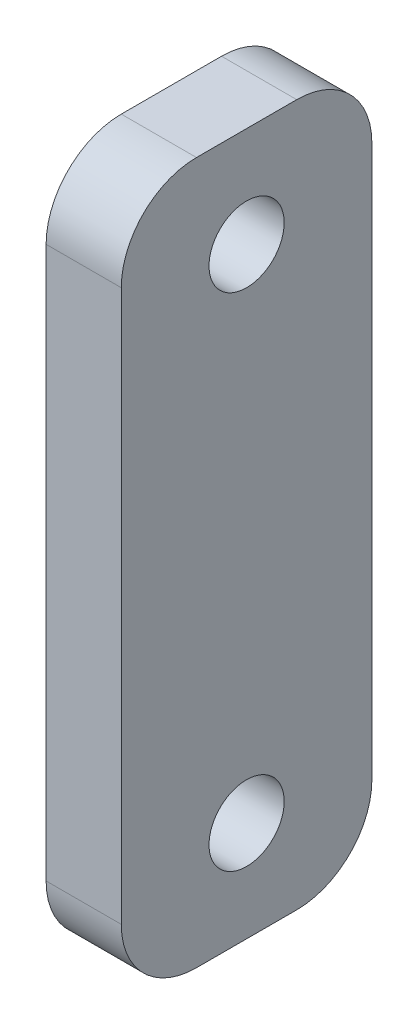
ISO-10303-21;
HEADER;
FILE_DESCRIPTION(('STEP AP214'),'2;1');
FILE_NAME('part.step','',(''),(''),'','','');
FILE_SCHEMA(('AUTOMOTIVE_DESIGN { 1 0 10303 214 1 1 1 1 }'));
ENDSEC;
DATA;
#1=APPLICATION_CONTEXT('core data for automotive mechanical design processes');
#2=APPLICATION_PROTOCOL_DEFINITION('international standard','automotive_design',2000,#1);
#3=PRODUCT_CONTEXT('',#1,'mechanical');
#4=PRODUCT('Part','Part','',(#3));
#5=PRODUCT_RELATED_PRODUCT_CATEGORY('part','',(#4));
#6=PRODUCT_DEFINITION_FORMATION('','',#4);
#7=PRODUCT_DEFINITION_CONTEXT('part definition',#1,'design');
#8=PRODUCT_DEFINITION('design','',#6,#7);
#9=PRODUCT_DEFINITION_SHAPE('','',#8);
#10=(LENGTH_UNIT() NAMED_UNIT(*) SI_UNIT(.MILLI.,.METRE.));
#11=(NAMED_UNIT(*) PLANE_ANGLE_UNIT() SI_UNIT($,.RADIAN.));
#12=(NAMED_UNIT(*) SI_UNIT($,.STERADIAN.) SOLID_ANGLE_UNIT());
#13=UNCERTAINTY_MEASURE_WITH_UNIT(LENGTH_MEASURE(1.E-05),#10,'distance_accuracy_value','');
#14=(GEOMETRIC_REPRESENTATION_CONTEXT(3) GLOBAL_UNCERTAINTY_ASSIGNED_CONTEXT((#13)) GLOBAL_UNIT_ASSIGNED_CONTEXT((#10,
#11,#12)) REPRESENTATION_CONTEXT('',''));
#15=CARTESIAN_POINT('',(0.,0.,0.));
#16=DIRECTION('',(0.,0.,1.));
#17=DIRECTION('',(1.,0.,0.));
#18=AXIS2_PLACEMENT_3D('',#15,#16,#17);
#19=CARTESIAN_POINT('',(15.,0.,-25.));
#20=DIRECTION('',(0.,0.,-1.));
#21=DIRECTION('',(-1.,0.,0.));
#22=AXIS2_PLACEMENT_3D('',#19,#20,#21);
#23=PLANE('',#22);
#24=DIRECTION('',(0.,-1.,0.));
#25=VECTOR('',#24,1.);
#26=CARTESIAN_POINT('',(15.,0.,-25.));
#27=LINE('',#26,#25);
#28=CARTESIAN_POINT('',(15.,55.,-25.));
#29=VERTEX_POINT('',#28);
#30=CARTESIAN_POINT('',(15.,-55.,-25.));
#31=VERTEX_POINT('',#30);
#32=EDGE_CURVE('E186',#29,#31,#27,.T.);
#33=ORIENTED_EDGE('',*,*,#32,.T.);
#34=DIRECTION('',(-1.,0.,0.));
#35=VECTOR('',#34,1.);
#36=CARTESIAN_POINT('',(0.,-55.,-25.));
#37=LINE('',#36,#35);
#38=CARTESIAN_POINT('',(0.,-55.,-25.));
#39=VERTEX_POINT('',#38);
#40=EDGE_CURVE('E128',#31,#39,#37,.T.);
#41=ORIENTED_EDGE('',*,*,#40,.T.);
#42=DIRECTION('',(0.,-1.,0.));
#43=VECTOR('',#42,1.);
#44=CARTESIAN_POINT('',(0.,0.,-25.));
#45=LINE('',#44,#43);
#46=CARTESIAN_POINT('',(0.,55.,-25.));
#47=VERTEX_POINT('',#46);
#48=EDGE_CURVE('E112',#47,#39,#45,.T.);
#49=ORIENTED_EDGE('',*,*,#48,.F.);
#50=DIRECTION('',(-1.,0.,0.));
#51=VECTOR('',#50,1.);
#52=CARTESIAN_POINT('',(15.,55.,-25.));
#53=LINE('',#52,#51);
#54=EDGE_CURVE('E125',#47,#29,#53,.F.);
#55=ORIENTED_EDGE('',*,*,#54,.T.);
#56=EDGE_LOOP('',(#33,#41,#49,#55));
#57=FACE_BOUND('',#56,.T.);
#58=ADVANCED_FACE('F41',(#57),#23,.T.);
#59=CARTESIAN_POINT('',(15.,70.,0.));
#60=DIRECTION('',(0.,1.,0.));
#61=DIRECTION('',(0.,0.,1.));
#62=AXIS2_PLACEMENT_3D('',#59,#60,#61);
#63=PLANE('',#62);
#64=DIRECTION('',(0.,0.,-1.));
#65=VECTOR('',#64,1.);
#66=CARTESIAN_POINT('',(15.,70.,0.));
#67=LINE('',#66,#65);
#68=CARTESIAN_POINT('',(15.,70.,10.));
#69=VERTEX_POINT('',#68);
#70=CARTESIAN_POINT('',(15.,70.,-10.));
#71=VERTEX_POINT('',#70);
#72=EDGE_CURVE('E182',#69,#71,#67,.T.);
#73=ORIENTED_EDGE('',*,*,#72,.T.);
#74=DIRECTION('',(-1.,0.,0.));
#75=VECTOR('',#74,1.);
#76=CARTESIAN_POINT('',(15.,70.,-10.));
#77=LINE('',#76,#75);
#78=CARTESIAN_POINT('',(0.,70.,-10.));
#79=VERTEX_POINT('',#78);
#80=EDGE_CURVE('E11',#71,#79,#77,.T.);
#81=ORIENTED_EDGE('',*,*,#80,.T.);
#82=DIRECTION('',(0.,0.,-1.));
#83=VECTOR('',#82,1.);
#84=CARTESIAN_POINT('',(0.,70.,0.));
#85=LINE('',#84,#83);
#86=CARTESIAN_POINT('',(0.,70.,10.));
#87=VERTEX_POINT('',#86);
#88=EDGE_CURVE('E114',#87,#79,#85,.T.);
#89=ORIENTED_EDGE('',*,*,#88,.F.);
#90=DIRECTION('',(-1.,0.,0.));
#91=VECTOR('',#90,1.);
#92=CARTESIAN_POINT('',(15.,70.,10.));
#93=LINE('',#92,#91);
#94=EDGE_CURVE('E50',#87,#69,#93,.F.);
#95=ORIENTED_EDGE('',*,*,#94,.T.);
#96=EDGE_LOOP('',(#73,#81,#89,#95));
#97=FACE_BOUND('',#96,.T.);
#98=ADVANCED_FACE('F181',(#97),#63,.T.);
#99=CARTESIAN_POINT('',(15.,0.,25.));
#100=DIRECTION('',(0.,0.,-1.));
#101=DIRECTION('',(-1.,0.,0.));
#102=AXIS2_PLACEMENT_3D('',#99,#100,#101);
#103=PLANE('',#102);
#104=DIRECTION('',(0.,-1.,0.));
#105=VECTOR('',#104,1.);
#106=CARTESIAN_POINT('',(0.,0.,25.));
#107=LINE('',#106,#105);
#108=CARTESIAN_POINT('',(0.,55.,25.));
#109=VERTEX_POINT('',#108);
#110=CARTESIAN_POINT('',(0.,-55.,25.));
#111=VERTEX_POINT('',#110);
#112=EDGE_CURVE('E191',#109,#111,#107,.T.);
#113=ORIENTED_EDGE('',*,*,#112,.T.);
#114=DIRECTION('',(-1.,0.,0.));
#115=VECTOR('',#114,1.);
#116=CARTESIAN_POINT('',(15.,-55.,25.));
#117=LINE('',#116,#115);
#118=CARTESIAN_POINT('',(15.,-55.,25.));
#119=VERTEX_POINT('',#118);
#120=EDGE_CURVE('E57',#111,#119,#117,.F.);
#121=ORIENTED_EDGE('',*,*,#120,.T.);
#122=DIRECTION('',(0.,-1.,0.));
#123=VECTOR('',#122,1.);
#124=CARTESIAN_POINT('',(15.,0.,25.));
#125=LINE('',#124,#123);
#126=CARTESIAN_POINT('',(15.,55.,25.));
#127=VERTEX_POINT('',#126);
#128=EDGE_CURVE('E142',#127,#119,#125,.T.);
#129=ORIENTED_EDGE('',*,*,#128,.F.);
#130=DIRECTION('',(-1.,0.,0.));
#131=VECTOR('',#130,1.);
#132=CARTESIAN_POINT('',(0.,55.,25.));
#133=LINE('',#132,#131);
#134=EDGE_CURVE('E172',#127,#109,#133,.T.);
#135=ORIENTED_EDGE('',*,*,#134,.T.);
#136=EDGE_LOOP('',(#113,#121,#129,#135));
#137=FACE_BOUND('',#136,.T.);
#138=ADVANCED_FACE('F190',(#137),#103,.F.);
#139=CARTESIAN_POINT('',(15.,-70.,0.));
#140=DIRECTION('',(0.,1.,0.));
#141=DIRECTION('',(0.,0.,1.));
#142=AXIS2_PLACEMENT_3D('',#139,#140,#141);
#143=PLANE('',#142);
#144=DIRECTION('',(0.,0.,-1.));
#145=VECTOR('',#144,1.);
#146=CARTESIAN_POINT('',(0.,-70.,0.));
#147=LINE('',#146,#145);
#148=CARTESIAN_POINT('',(0.,-70.,10.));
#149=VERTEX_POINT('',#148);
#150=CARTESIAN_POINT('',(0.,-70.,-10.));
#151=VERTEX_POINT('',#150);
#152=EDGE_CURVE('E145',#149,#151,#147,.T.);
#153=ORIENTED_EDGE('',*,*,#152,.T.);
#154=DIRECTION('',(-1.,0.,0.));
#155=VECTOR('',#154,1.);
#156=CARTESIAN_POINT('',(15.,-70.,-10.));
#157=LINE('',#156,#155);
#158=CARTESIAN_POINT('',(15.,-70.,-10.));
#159=VERTEX_POINT('',#158);
#160=EDGE_CURVE('E159',#151,#159,#157,.F.);
#161=ORIENTED_EDGE('',*,*,#160,.T.);
#162=DIRECTION('',(0.,0.,-1.));
#163=VECTOR('',#162,1.);
#164=CARTESIAN_POINT('',(15.,-70.,0.));
#165=LINE('',#164,#163);
#166=CARTESIAN_POINT('',(15.,-70.,10.));
#167=VERTEX_POINT('',#166);
#168=EDGE_CURVE('E136',#167,#159,#165,.T.);
#169=ORIENTED_EDGE('',*,*,#168,.F.);
#170=DIRECTION('',(-1.,0.,0.));
#171=VECTOR('',#170,1.);
#172=CARTESIAN_POINT('',(15.,-70.,10.));
#173=LINE('',#172,#171);
#174=EDGE_CURVE('E155',#167,#149,#173,.T.);
#175=ORIENTED_EDGE('',*,*,#174,.T.);
#176=EDGE_LOOP('',(#153,#161,#169,#175));
#177=FACE_BOUND('',#176,.T.);
#178=ADVANCED_FACE('F224',(#177),#143,.F.);
#179=CARTESIAN_POINT('',(15.,0.,0.));
#180=DIRECTION('',(1.,0.,0.));
#181=DIRECTION('',(0.,0.,-1.));
#182=AXIS2_PLACEMENT_3D('',#179,#180,#181);
#183=PLANE('',#182);
#184=CARTESIAN_POINT('',(15.,-50.,0.));
#185=DIRECTION('',(1.,0.,0.));
#186=DIRECTION('',(0.,0.,-1.));
#187=AXIS2_PLACEMENT_3D('',#184,#185,#186);
#188=CIRCLE('',#187,7.5);
#189=CARTESIAN_POINT('',(15.,-50.,-7.50000000000001));
#190=VERTEX_POINT('',#189);
#191=EDGE_CURVE('E130',#190,#190,#188,.T.);
#192=ORIENTED_EDGE('',*,*,#191,.F.);
#193=EDGE_LOOP('',(#192));
#194=FACE_BOUND('',#193,.T.);
#195=CARTESIAN_POINT('',(15.,50.,0.));
#196=DIRECTION('',(1.,0.,0.));
#197=DIRECTION('',(0.,0.,-1.));
#198=AXIS2_PLACEMENT_3D('',#195,#196,#197);
#199=CIRCLE('',#198,7.5);
#200=CARTESIAN_POINT('',(15.,50.,-7.50000000000001));
#201=VERTEX_POINT('',#200);
#202=EDGE_CURVE('E203',#201,#201,#199,.T.);
#203=ORIENTED_EDGE('',*,*,#202,.F.);
#204=EDGE_LOOP('',(#203));
#205=FACE_BOUND('',#204,.T.);
#206=ORIENTED_EDGE('',*,*,#168,.T.);
#207=CARTESIAN_POINT('',(15.,-55.,-10.));
#208=DIRECTION('',(1.,0.,0.));
#209=DIRECTION('',(0.,0.,-1.));
#210=AXIS2_PLACEMENT_3D('',#207,#208,#209);
#211=CIRCLE('',#210,15.);
#212=EDGE_CURVE('E169',#159,#31,#211,.T.);
#213=ORIENTED_EDGE('',*,*,#212,.T.);
#214=ORIENTED_EDGE('',*,*,#32,.F.);
#215=CARTESIAN_POINT('',(15.,55.,-10.));
#216=DIRECTION('',(1.,0.,0.));
#217=DIRECTION('',(0.,0.,-1.));
#218=AXIS2_PLACEMENT_3D('',#215,#216,#217);
#219=CIRCLE('',#218,15.);
#220=EDGE_CURVE('E134',#29,#71,#219,.T.);
#221=ORIENTED_EDGE('',*,*,#220,.T.);
#222=ORIENTED_EDGE('',*,*,#72,.F.);
#223=CARTESIAN_POINT('',(15.,55.,10.));
#224=DIRECTION('',(1.,0.,0.));
#225=DIRECTION('',(0.,0.,-1.));
#226=AXIS2_PLACEMENT_3D('',#223,#224,#225);
#227=CIRCLE('',#226,15.);
#228=EDGE_CURVE('E64',#69,#127,#227,.T.);
#229=ORIENTED_EDGE('',*,*,#228,.T.);
#230=ORIENTED_EDGE('',*,*,#128,.T.);
#231=CARTESIAN_POINT('',(15.,-55.,10.));
#232=DIRECTION('',(1.,0.,0.));
#233=DIRECTION('',(0.,0.,-1.));
#234=AXIS2_PLACEMENT_3D('',#231,#232,#233);
#235=CIRCLE('',#234,15.);
#236=EDGE_CURVE('E166',#119,#167,#235,.T.);
#237=ORIENTED_EDGE('',*,*,#236,.T.);
#238=EDGE_LOOP('',(#206,#213,#214,#221,#222,#229,#230,#237));
#239=FACE_BOUND('',#238,.T.);
#240=ADVANCED_FACE('F184',(#194,#205,#239),#183,.T.);
#241=CARTESIAN_POINT('',(0.,0.,0.));
#242=DIRECTION('',(1.,0.,0.));
#243=DIRECTION('',(0.,0.,-1.));
#244=AXIS2_PLACEMENT_3D('',#241,#242,#243);
#245=PLANE('',#244);
#246=CARTESIAN_POINT('',(0.,-50.,0.));
#247=DIRECTION('',(1.,0.,0.));
#248=DIRECTION('',(0.,0.,-1.));
#249=AXIS2_PLACEMENT_3D('',#246,#247,#248);
#250=CIRCLE('',#249,7.5);
#251=CARTESIAN_POINT('',(0.,-50.,-7.50000000000001));
#252=VERTEX_POINT('',#251);
#253=EDGE_CURVE('E211',#252,#252,#250,.T.);
#254=ORIENTED_EDGE('',*,*,#253,.T.);
#255=EDGE_LOOP('',(#254));
#256=FACE_BOUND('',#255,.T.);
#257=CARTESIAN_POINT('',(0.,50.,0.));
#258=DIRECTION('',(1.,0.,0.));
#259=DIRECTION('',(0.,0.,-1.));
#260=AXIS2_PLACEMENT_3D('',#257,#258,#259);
#261=CIRCLE('',#260,7.5);
#262=CARTESIAN_POINT('',(0.,50.,-7.50000000000001));
#263=VERTEX_POINT('',#262);
#264=EDGE_CURVE('E207',#263,#263,#261,.T.);
#265=ORIENTED_EDGE('',*,*,#264,.T.);
#266=EDGE_LOOP('',(#265));
#267=FACE_BOUND('',#266,.T.);
#268=ORIENTED_EDGE('',*,*,#48,.T.);
#269=CARTESIAN_POINT('',(0.,-55.,-10.));
#270=DIRECTION('',(1.,0.,0.));
#271=DIRECTION('',(0.,0.,-1.));
#272=AXIS2_PLACEMENT_3D('',#269,#270,#271);
#273=CIRCLE('',#272,15.);
#274=EDGE_CURVE('E152',#39,#151,#273,.F.);
#275=ORIENTED_EDGE('',*,*,#274,.T.);
#276=ORIENTED_EDGE('',*,*,#152,.F.);
#277=CARTESIAN_POINT('',(0.,-55.,10.));
#278=DIRECTION('',(1.,0.,0.));
#279=DIRECTION('',(0.,0.,-1.));
#280=AXIS2_PLACEMENT_3D('',#277,#278,#279);
#281=CIRCLE('',#280,15.);
#282=EDGE_CURVE('E119',#149,#111,#281,.F.);
#283=ORIENTED_EDGE('',*,*,#282,.T.);
#284=ORIENTED_EDGE('',*,*,#112,.F.);
#285=CARTESIAN_POINT('',(0.,55.,10.));
#286=DIRECTION('',(1.,0.,0.));
#287=DIRECTION('',(0.,0.,-1.));
#288=AXIS2_PLACEMENT_3D('',#285,#286,#287);
#289=CIRCLE('',#288,15.);
#290=EDGE_CURVE('E120',#109,#87,#289,.F.);
#291=ORIENTED_EDGE('',*,*,#290,.T.);
#292=ORIENTED_EDGE('',*,*,#88,.T.);
#293=CARTESIAN_POINT('',(0.,55.,-10.));
#294=DIRECTION('',(1.,0.,0.));
#295=DIRECTION('',(0.,0.,-1.));
#296=AXIS2_PLACEMENT_3D('',#293,#294,#295);
#297=CIRCLE('',#296,15.);
#298=EDGE_CURVE('E109',#79,#47,#297,.F.);
#299=ORIENTED_EDGE('',*,*,#298,.T.);
#300=EDGE_LOOP('',(#268,#275,#276,#283,#284,#291,#292,#299));
#301=FACE_BOUND('',#300,.T.);
#302=ADVANCED_FACE('F111',(#256,#267,#301),#245,.F.);
#303=CARTESIAN_POINT('',(15.,50.,0.));
#304=DIRECTION('',(-1.,0.,0.));
#305=DIRECTION('',(0.,0.,1.));
#306=AXIS2_PLACEMENT_3D('',#303,#304,#305);
#307=CYLINDRICAL_SURFACE('',#306,7.5);
#308=ORIENTED_EDGE('',*,*,#202,.T.);
#309=EDGE_LOOP('',(#308));
#310=FACE_BOUND('',#309,.T.);
#311=ORIENTED_EDGE('',*,*,#264,.F.);
#312=EDGE_LOOP('',(#311));
#313=FACE_BOUND('',#312,.T.);
#314=ADVANCED_FACE('F228',(#310,#313),#307,.F.);
#315=CARTESIAN_POINT('',(15.,-50.,0.));
#316=DIRECTION('',(-1.,0.,0.));
#317=DIRECTION('',(0.,0.,1.));
#318=AXIS2_PLACEMENT_3D('',#315,#316,#317);
#319=CYLINDRICAL_SURFACE('',#318,7.5);
#320=ORIENTED_EDGE('',*,*,#191,.T.);
#321=EDGE_LOOP('',(#320));
#322=FACE_BOUND('',#321,.T.);
#323=ORIENTED_EDGE('',*,*,#253,.F.);
#324=EDGE_LOOP('',(#323));
#325=FACE_BOUND('',#324,.T.);
#326=ADVANCED_FACE('F219',(#322,#325),#319,.F.);
#327=CARTESIAN_POINT('',(15.,-55.,-10.));
#328=DIRECTION('',(1.,0.,0.));
#329=DIRECTION('',(0.,0.,-1.));
#330=AXIS2_PLACEMENT_3D('',#327,#328,#329);
#331=CYLINDRICAL_SURFACE('',#330,15.);
#332=ORIENTED_EDGE('',*,*,#212,.F.);
#333=ORIENTED_EDGE('',*,*,#160,.F.);
#334=ORIENTED_EDGE('',*,*,#274,.F.);
#335=ORIENTED_EDGE('',*,*,#40,.F.);
#336=EDGE_LOOP('',(#332,#333,#334,#335));
#337=FACE_BOUND('',#336,.T.);
#338=ADVANCED_FACE('F248',(#337),#331,.T.);
#339=CARTESIAN_POINT('',(15.,-55.,10.));
#340=DIRECTION('',(-1.,0.,0.));
#341=DIRECTION('',(0.,0.,1.));
#342=AXIS2_PLACEMENT_3D('',#339,#340,#341);
#343=CYLINDRICAL_SURFACE('',#342,15.);
#344=ORIENTED_EDGE('',*,*,#236,.F.);
#345=ORIENTED_EDGE('',*,*,#120,.F.);
#346=ORIENTED_EDGE('',*,*,#282,.F.);
#347=ORIENTED_EDGE('',*,*,#174,.F.);
#348=EDGE_LOOP('',(#344,#345,#346,#347));
#349=FACE_BOUND('',#348,.T.);
#350=ADVANCED_FACE('F251',(#349),#343,.T.);
#351=CARTESIAN_POINT('',(15.,55.,-10.));
#352=DIRECTION('',(-1.,0.,0.));
#353=DIRECTION('',(0.,0.,1.));
#354=AXIS2_PLACEMENT_3D('',#351,#352,#353);
#355=CYLINDRICAL_SURFACE('',#354,15.);
#356=ORIENTED_EDGE('',*,*,#220,.F.);
#357=ORIENTED_EDGE('',*,*,#54,.F.);
#358=ORIENTED_EDGE('',*,*,#298,.F.);
#359=ORIENTED_EDGE('',*,*,#80,.F.);
#360=EDGE_LOOP('',(#356,#357,#358,#359));
#361=FACE_BOUND('',#360,.T.);
#362=ADVANCED_FACE('F133',(#361),#355,.T.);
#363=CARTESIAN_POINT('',(15.,55.,10.));
#364=DIRECTION('',(1.,0.,0.));
#365=DIRECTION('',(0.,0.,-1.));
#366=AXIS2_PLACEMENT_3D('',#363,#364,#365);
#367=CYLINDRICAL_SURFACE('',#366,15.);
#368=ORIENTED_EDGE('',*,*,#228,.F.);
#369=ORIENTED_EDGE('',*,*,#94,.F.);
#370=ORIENTED_EDGE('',*,*,#290,.F.);
#371=ORIENTED_EDGE('',*,*,#134,.F.);
#372=EDGE_LOOP('',(#368,#369,#370,#371));
#373=FACE_BOUND('',#372,.T.);
#374=ADVANCED_FACE('F43',(#373),#367,.T.);
#375=CLOSED_SHELL('',(#58,#98,#138,#178,#240,#302,#314,#326,#338,#350,#362,#374));
#376=MANIFOLD_SOLID_BREP('B2',#375);
#377=ADVANCED_BREP_SHAPE_REPRESENTATION('',(#18,#376),#14);
#378=SHAPE_DEFINITION_REPRESENTATION(#9,#377);
ENDSEC;
END-ISO-10303-21;
